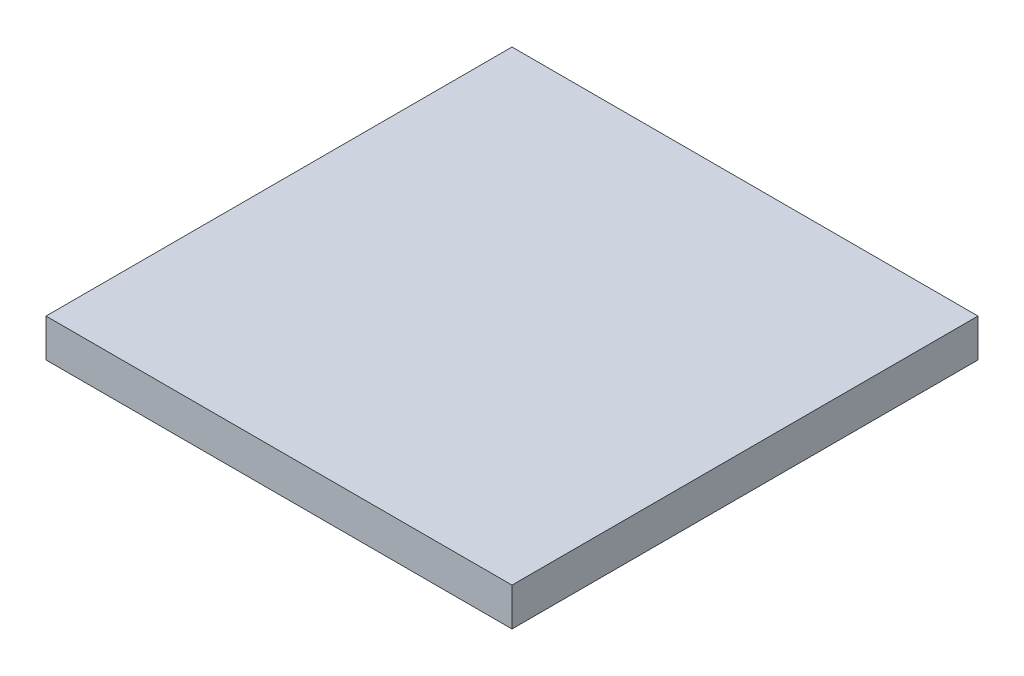
ISO-10303-21;
HEADER;
FILE_DESCRIPTION(('STEP AP214'),'2;1');
FILE_NAME('part.step','',(''),(''),'','','');
FILE_SCHEMA(('AUTOMOTIVE_DESIGN { 1 0 10303 214 1 1 1 1 }'));
ENDSEC;
DATA;
#1=APPLICATION_CONTEXT('core data for automotive mechanical design processes');
#2=APPLICATION_PROTOCOL_DEFINITION('international standard','automotive_design',2000,#1);
#3=PRODUCT_CONTEXT('',#1,'mechanical');
#4=PRODUCT('Part','Part','',(#3));
#5=PRODUCT_RELATED_PRODUCT_CATEGORY('part','',(#4));
#6=PRODUCT_DEFINITION_FORMATION('','',#4);
#7=PRODUCT_DEFINITION_CONTEXT('part definition',#1,'design');
#8=PRODUCT_DEFINITION('design','',#6,#7);
#9=PRODUCT_DEFINITION_SHAPE('','',#8);
#10=(LENGTH_UNIT() NAMED_UNIT(*) SI_UNIT(.MILLI.,.METRE.));
#11=(NAMED_UNIT(*) PLANE_ANGLE_UNIT() SI_UNIT($,.RADIAN.));
#12=(NAMED_UNIT(*) SI_UNIT($,.STERADIAN.) SOLID_ANGLE_UNIT());
#13=UNCERTAINTY_MEASURE_WITH_UNIT(LENGTH_MEASURE(1.E-05),#10,'distance_accuracy_value','');
#14=(GEOMETRIC_REPRESENTATION_CONTEXT(3) GLOBAL_UNCERTAINTY_ASSIGNED_CONTEXT((#13)) GLOBAL_UNIT_ASSIGNED_CONTEXT((#10,
#11,#12)) REPRESENTATION_CONTEXT('',''));
#15=CARTESIAN_POINT('',(0.,0.,0.));
#16=DIRECTION('',(0.,0.,1.));
#17=DIRECTION('',(1.,0.,0.));
#18=AXIS2_PLACEMENT_3D('',#15,#16,#17);
#19=CARTESIAN_POINT('',(0.,2.,0.));
#20=DIRECTION('',(1.,0.,0.));
#21=DIRECTION('',(0.,0.,-1.));
#22=AXIS2_PLACEMENT_3D('',#19,#20,#21);
#23=PLANE('',#22);
#24=DIRECTION('',(0.,0.,1.));
#25=VECTOR('',#24,1.);
#26=CARTESIAN_POINT('',(0.,0.,0.));
#27=LINE('',#26,#25);
#28=CARTESIAN_POINT('',(0.,0.,-24.5));
#29=VERTEX_POINT('',#28);
#30=CARTESIAN_POINT('',(0.,0.,0.));
#31=VERTEX_POINT('',#30);
#32=EDGE_CURVE('E96',#29,#31,#27,.T.);
#33=ORIENTED_EDGE('',*,*,#32,.T.);
#34=DIRECTION('',(0.,-1.,0.));
#35=VECTOR('',#34,1.);
#36=CARTESIAN_POINT('',(0.,2.,0.));
#37=LINE('',#36,#35);
#38=CARTESIAN_POINT('',(0.,2.,0.));
#39=VERTEX_POINT('',#38);
#40=EDGE_CURVE('E11',#39,#31,#37,.T.);
#41=ORIENTED_EDGE('',*,*,#40,.F.);
#42=DIRECTION('',(0.,0.,1.));
#43=VECTOR('',#42,1.);
#44=CARTESIAN_POINT('',(0.,2.,0.));
#45=LINE('',#44,#43);
#46=CARTESIAN_POINT('',(0.,2.,-24.5));
#47=VERTEX_POINT('',#46);
#48=EDGE_CURVE('E84',#47,#39,#45,.T.);
#49=ORIENTED_EDGE('',*,*,#48,.F.);
#50=DIRECTION('',(0.,-1.,0.));
#51=VECTOR('',#50,1.);
#52=CARTESIAN_POINT('',(0.,2.,-24.5));
#53=LINE('',#52,#51);
#54=EDGE_CURVE('E92',#47,#29,#53,.T.);
#55=ORIENTED_EDGE('',*,*,#54,.T.);
#56=EDGE_LOOP('',(#33,#41,#49,#55));
#57=FACE_BOUND('',#56,.T.);
#58=ADVANCED_FACE('F33',(#57),#23,.F.);
#59=CARTESIAN_POINT('',(0.,2.,0.));
#60=DIRECTION('',(0.,0.,-1.));
#61=DIRECTION('',(-1.,0.,0.));
#62=AXIS2_PLACEMENT_3D('',#59,#60,#61);
#63=PLANE('',#62);
#64=DIRECTION('',(1.,0.,0.));
#65=VECTOR('',#64,1.);
#66=CARTESIAN_POINT('',(0.,0.,0.));
#67=LINE('',#66,#65);
#68=CARTESIAN_POINT('',(24.5,0.,0.));
#69=VERTEX_POINT('',#68);
#70=EDGE_CURVE('E88',#31,#69,#67,.T.);
#71=ORIENTED_EDGE('',*,*,#70,.T.);
#72=DIRECTION('',(0.,-1.,0.));
#73=VECTOR('',#72,1.);
#74=CARTESIAN_POINT('',(24.5,2.,0.));
#75=LINE('',#74,#73);
#76=CARTESIAN_POINT('',(24.5,2.,0.));
#77=VERTEX_POINT('',#76);
#78=EDGE_CURVE('E41',#77,#69,#75,.T.);
#79=ORIENTED_EDGE('',*,*,#78,.F.);
#80=DIRECTION('',(1.,0.,0.));
#81=VECTOR('',#80,1.);
#82=CARTESIAN_POINT('',(0.,2.,0.));
#83=LINE('',#82,#81);
#84=EDGE_CURVE('E79',#39,#77,#83,.T.);
#85=ORIENTED_EDGE('',*,*,#84,.F.);
#86=ORIENTED_EDGE('',*,*,#40,.T.);
#87=EDGE_LOOP('',(#71,#79,#85,#86));
#88=FACE_BOUND('',#87,.T.);
#89=ADVANCED_FACE('F87',(#88),#63,.F.);
#90=CARTESIAN_POINT('',(24.5,2.,0.));
#91=DIRECTION('',(-1.,0.,0.));
#92=DIRECTION('',(0.,0.,1.));
#93=AXIS2_PLACEMENT_3D('',#90,#91,#92);
#94=PLANE('',#93);
#95=DIRECTION('',(0.,0.,-1.));
#96=VECTOR('',#95,1.);
#97=CARTESIAN_POINT('',(24.5,0.,0.));
#98=LINE('',#97,#96);
#99=CARTESIAN_POINT('',(24.5,0.,-24.5));
#100=VERTEX_POINT('',#99);
#101=EDGE_CURVE('E66',#69,#100,#98,.T.);
#102=ORIENTED_EDGE('',*,*,#101,.T.);
#103=DIRECTION('',(0.,-1.,0.));
#104=VECTOR('',#103,1.);
#105=CARTESIAN_POINT('',(24.5,2.,-24.5));
#106=LINE('',#105,#104);
#107=CARTESIAN_POINT('',(24.5,2.,-24.5));
#108=VERTEX_POINT('',#107);
#109=EDGE_CURVE('E89',#108,#100,#106,.T.);
#110=ORIENTED_EDGE('',*,*,#109,.F.);
#111=DIRECTION('',(0.,0.,-1.));
#112=VECTOR('',#111,1.);
#113=CARTESIAN_POINT('',(24.5,2.,0.));
#114=LINE('',#113,#112);
#115=EDGE_CURVE('E82',#77,#108,#114,.T.);
#116=ORIENTED_EDGE('',*,*,#115,.F.);
#117=ORIENTED_EDGE('',*,*,#78,.T.);
#118=EDGE_LOOP('',(#102,#110,#116,#117));
#119=FACE_BOUND('',#118,.T.);
#120=ADVANCED_FACE('F90',(#119),#94,.F.);
#121=CARTESIAN_POINT('',(0.,2.,-24.5));
#122=DIRECTION('',(0.,0.,1.));
#123=DIRECTION('',(1.,0.,0.));
#124=AXIS2_PLACEMENT_3D('',#121,#122,#123);
#125=PLANE('',#124);
#126=DIRECTION('',(-1.,0.,0.));
#127=VECTOR('',#126,1.);
#128=CARTESIAN_POINT('',(0.,0.,-24.5));
#129=LINE('',#128,#127);
#130=EDGE_CURVE('E72',#100,#29,#129,.T.);
#131=ORIENTED_EDGE('',*,*,#130,.T.);
#132=ORIENTED_EDGE('',*,*,#54,.F.);
#133=DIRECTION('',(-1.,0.,0.));
#134=VECTOR('',#133,1.);
#135=CARTESIAN_POINT('',(0.,2.,-24.5));
#136=LINE('',#135,#134);
#137=EDGE_CURVE('E49',#108,#47,#136,.T.);
#138=ORIENTED_EDGE('',*,*,#137,.F.);
#139=ORIENTED_EDGE('',*,*,#109,.T.);
#140=EDGE_LOOP('',(#131,#132,#138,#139));
#141=FACE_BOUND('',#140,.T.);
#142=ADVANCED_FACE('F103',(#141),#125,.F.);
#143=CARTESIAN_POINT('',(0.,2.,0.));
#144=DIRECTION('',(0.,-1.,0.));
#145=DIRECTION('',(0.,0.,-1.));
#146=AXIS2_PLACEMENT_3D('',#143,#144,#145);
#147=PLANE('',#146);
#148=ORIENTED_EDGE('',*,*,#48,.T.);
#149=ORIENTED_EDGE('',*,*,#84,.T.);
#150=ORIENTED_EDGE('',*,*,#115,.T.);
#151=ORIENTED_EDGE('',*,*,#137,.T.);
#152=EDGE_LOOP('',(#148,#149,#150,#151));
#153=FACE_BOUND('',#152,.T.);
#154=ADVANCED_FACE('F80',(#153),#147,.F.);
#155=CARTESIAN_POINT('',(0.,0.,0.));
#156=DIRECTION('',(0.,-1.,0.));
#157=DIRECTION('',(0.,0.,-1.));
#158=AXIS2_PLACEMENT_3D('',#155,#156,#157);
#159=PLANE('',#158);
#160=ORIENTED_EDGE('',*,*,#32,.F.);
#161=ORIENTED_EDGE('',*,*,#130,.F.);
#162=ORIENTED_EDGE('',*,*,#101,.F.);
#163=ORIENTED_EDGE('',*,*,#70,.F.);
#164=EDGE_LOOP('',(#160,#161,#162,#163));
#165=FACE_BOUND('',#164,.T.);
#166=ADVANCED_FACE('F106',(#165),#159,.T.);
#167=CLOSED_SHELL('',(#58,#89,#120,#142,#154,#166));
#168=MANIFOLD_SOLID_BREP('B2',#167);
#169=ADVANCED_BREP_SHAPE_REPRESENTATION('',(#18,#168),#14);
#170=SHAPE_DEFINITION_REPRESENTATION(#9,#169);
ENDSEC;
END-ISO-10303-21;
